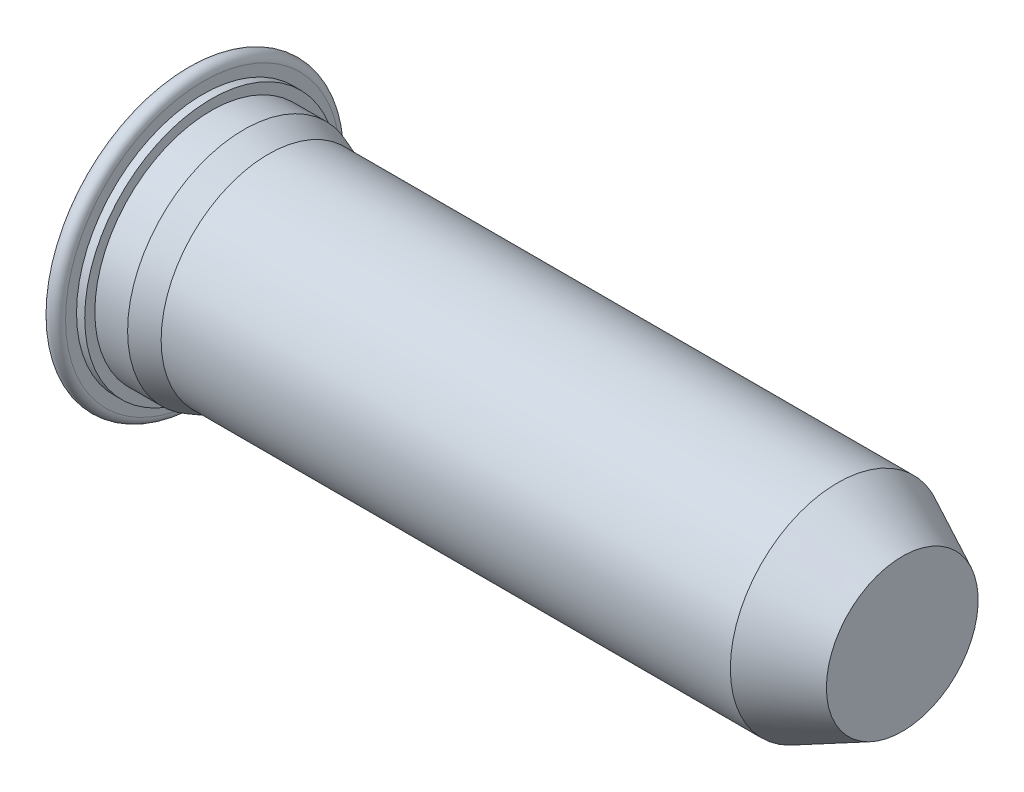
ISO-10303-21;
HEADER;
FILE_DESCRIPTION(('STEP AP214'),'2;1');
FILE_NAME('part.step','',(''),(''),'','','');
FILE_SCHEMA(('AUTOMOTIVE_DESIGN { 1 0 10303 214 1 1 1 1 }'));
ENDSEC;
DATA;
#1=APPLICATION_CONTEXT('core data for automotive mechanical design processes');
#2=APPLICATION_PROTOCOL_DEFINITION('international standard','automotive_design',2000,#1);
#3=PRODUCT_CONTEXT('',#1,'mechanical');
#4=PRODUCT('Part','Part','',(#3));
#5=PRODUCT_RELATED_PRODUCT_CATEGORY('part','',(#4));
#6=PRODUCT_DEFINITION_FORMATION('','',#4);
#7=PRODUCT_DEFINITION_CONTEXT('part definition',#1,'design');
#8=PRODUCT_DEFINITION('design','',#6,#7);
#9=PRODUCT_DEFINITION_SHAPE('','',#8);
#10=(LENGTH_UNIT() NAMED_UNIT(*) SI_UNIT(.MILLI.,.METRE.));
#11=(NAMED_UNIT(*) PLANE_ANGLE_UNIT() SI_UNIT($,.RADIAN.));
#12=(NAMED_UNIT(*) SI_UNIT($,.STERADIAN.) SOLID_ANGLE_UNIT());
#13=UNCERTAINTY_MEASURE_WITH_UNIT(LENGTH_MEASURE(1.E-05),#10,'distance_accuracy_value','');
#14=(GEOMETRIC_REPRESENTATION_CONTEXT(3) GLOBAL_UNCERTAINTY_ASSIGNED_CONTEXT((#13)) GLOBAL_UNIT_ASSIGNED_CONTEXT((#10,
#11,#12)) REPRESENTATION_CONTEXT('',''));
#15=CARTESIAN_POINT('',(0.,0.,0.));
#16=DIRECTION('',(0.,0.,1.));
#17=DIRECTION('',(1.,0.,0.));
#18=AXIS2_PLACEMENT_3D('',#15,#16,#17);
#19=CARTESIAN_POINT('',(0.,0.,0.));
#20=DIRECTION('',(-1.,0.,0.));
#21=DIRECTION('',(0.,0.,1.));
#22=AXIS2_PLACEMENT_3D('',#19,#20,#21);
#23=PLANE('',#22);
#24=CARTESIAN_POINT('',(0.,0.,0.));
#25=DIRECTION('',(-1.,0.,0.));
#26=DIRECTION('',(0.,0.,1.));
#27=AXIS2_PLACEMENT_3D('',#24,#25,#26);
#28=CIRCLE('',#27,3.83346);
#29=CARTESIAN_POINT('',(0.,0.,3.83346));
#30=VERTEX_POINT('',#29);
#31=EDGE_CURVE('E10',#30,#30,#28,.T.);
#32=ORIENTED_EDGE('',*,*,#31,.T.);
#33=EDGE_LOOP('',(#32));
#34=FACE_BOUND('',#33,.T.);
#35=ADVANCED_FACE('F30',(#34),#23,.T.);
#36=CARTESIAN_POINT('',(0.,0.,0.));
#37=DIRECTION('',(-1.,0.,0.));
#38=DIRECTION('',(0.,0.,1.));
#39=AXIS2_PLACEMENT_3D('',#36,#37,#38);
#40=CYLINDRICAL_SURFACE('',#39,3.83346);
#41=CARTESIAN_POINT('',(0.00508000000000002,0.,0.));
#42=DIRECTION('',(-1.,0.,0.));
#43=DIRECTION('',(0.,0.,1.));
#44=AXIS2_PLACEMENT_3D('',#41,#42,#43);
#45=CIRCLE('',#44,3.83346);
#46=CARTESIAN_POINT('',(0.00508000000000002,0.,3.83346));
#47=VERTEX_POINT('',#46);
#48=EDGE_CURVE('E36',#47,#47,#45,.T.);
#49=ORIENTED_EDGE('',*,*,#48,.T.);
#50=EDGE_LOOP('',(#49));
#51=FACE_BOUND('',#50,.T.);
#52=ORIENTED_EDGE('',*,*,#31,.F.);
#53=EDGE_LOOP('',(#52));
#54=FACE_BOUND('',#53,.T.);
#55=ADVANCED_FACE('F83',(#51,#54),#40,.T.);
#56=CARTESIAN_POINT('',(0.00508000000000003,3.83854,0.));
#57=DIRECTION('',(1.,0.,0.));
#58=DIRECTION('',(0.,0.,-1.));
#59=AXIS2_PLACEMENT_3D('',#56,#57,#58);
#60=PLANE('',#59);
#61=ORIENTED_EDGE('',*,*,#48,.F.);
#62=EDGE_LOOP('',(#61));
#63=FACE_BOUND('',#62,.T.);
#64=CARTESIAN_POINT('',(0.00508000000000003,0.,0.));
#65=DIRECTION('',(-1.,0.,0.));
#66=DIRECTION('',(0.,0.,1.));
#67=AXIS2_PLACEMENT_3D('',#64,#65,#66);
#68=CIRCLE('',#67,3.83854);
#69=CARTESIAN_POINT('',(0.00508000000000003,0.,3.83854));
#70=VERTEX_POINT('',#69);
#71=EDGE_CURVE('E40',#70,#70,#68,.T.);
#72=ORIENTED_EDGE('',*,*,#71,.T.);
#73=EDGE_LOOP('',(#72));
#74=FACE_BOUND('',#73,.T.);
#75=ADVANCED_FACE('F87',(#63,#74),#60,.F.);
#76=CARTESIAN_POINT('',(0.23154,0.,0.));
#77=DIRECTION('',(-1.,0.,0.));
#78=DIRECTION('',(0.,0.,1.));
#79=AXIS2_PLACEMENT_3D('',#76,#77,#78);
#80=TOROIDAL_SURFACE('',#79,3.83854,0.22646);
#81=CARTESIAN_POINT('',(0.458,0.,0.));
#82=DIRECTION('',(-1.,0.,0.));
#83=DIRECTION('',(0.,0.,1.));
#84=AXIS2_PLACEMENT_3D('',#81,#82,#83);
#85=CIRCLE('',#84,3.83854);
#86=CARTESIAN_POINT('',(0.458,0.,3.83854));
#87=VERTEX_POINT('',#86);
#88=EDGE_CURVE('E44',#87,#87,#85,.T.);
#89=ORIENTED_EDGE('',*,*,#88,.T.);
#90=EDGE_LOOP('',(#89));
#91=FACE_BOUND('',#90,.T.);
#92=ORIENTED_EDGE('',*,*,#71,.F.);
#93=EDGE_LOOP('',(#92));
#94=FACE_BOUND('',#93,.T.);
#95=ADVANCED_FACE('F91',(#91,#94),#80,.T.);
#96=CARTESIAN_POINT('',(0.458,3.83854,0.));
#97=DIRECTION('',(1.,0.,0.));
#98=DIRECTION('',(0.,0.,-1.));
#99=AXIS2_PLACEMENT_3D('',#96,#97,#98);
#100=PLANE('',#99);
#101=CARTESIAN_POINT('',(0.458,0.,0.));
#102=DIRECTION('',(-1.,0.,0.));
#103=DIRECTION('',(0.,0.,1.));
#104=AXIS2_PLACEMENT_3D('',#101,#102,#103);
#105=CIRCLE('',#104,3.5325);
#106=CARTESIAN_POINT('',(0.458,0.,3.5325));
#107=VERTEX_POINT('',#106);
#108=EDGE_CURVE('E49',#107,#107,#105,.T.);
#109=ORIENTED_EDGE('',*,*,#108,.T.);
#110=EDGE_LOOP('',(#109));
#111=FACE_BOUND('',#110,.T.);
#112=ORIENTED_EDGE('',*,*,#88,.F.);
#113=EDGE_LOOP('',(#112));
#114=FACE_BOUND('',#113,.T.);
#115=ADVANCED_FACE('F98',(#111,#114),#100,.T.);
#116=CARTESIAN_POINT('',(0.,0.,0.));
#117=DIRECTION('',(-1.,0.,0.));
#118=DIRECTION('',(0.,0.,1.));
#119=AXIS2_PLACEMENT_3D('',#116,#117,#118);
#120=CYLINDRICAL_SURFACE('',#119,3.5325);
#121=CARTESIAN_POINT('',(0.687,0.,0.));
#122=DIRECTION('',(-1.,0.,0.));
#123=DIRECTION('',(0.,0.,1.));
#124=AXIS2_PLACEMENT_3D('',#121,#122,#123);
#125=CIRCLE('',#124,3.5325);
#126=CARTESIAN_POINT('',(0.687,0.,3.5325));
#127=VERTEX_POINT('',#126);
#128=EDGE_CURVE('E52',#127,#127,#125,.T.);
#129=ORIENTED_EDGE('',*,*,#128,.T.);
#130=EDGE_LOOP('',(#129));
#131=FACE_BOUND('',#130,.T.);
#132=ORIENTED_EDGE('',*,*,#108,.F.);
#133=EDGE_LOOP('',(#132));
#134=FACE_BOUND('',#133,.T.);
#135=ADVANCED_FACE('F102',(#131,#134),#120,.T.);
#136=CARTESIAN_POINT('',(0.687,3.5325,0.));
#137=DIRECTION('',(1.,0.,0.));
#138=DIRECTION('',(0.,0.,-1.));
#139=AXIS2_PLACEMENT_3D('',#136,#137,#138);
#140=PLANE('',#139);
#141=CARTESIAN_POINT('',(0.687,0.,0.));
#142=DIRECTION('',(-1.,0.,0.));
#143=DIRECTION('',(0.,0.,1.));
#144=AXIS2_PLACEMENT_3D('',#141,#142,#143);
#145=CIRCLE('',#144,3.25);
#146=CARTESIAN_POINT('',(0.687,0.,3.25));
#147=VERTEX_POINT('',#146);
#148=EDGE_CURVE('E55',#147,#147,#145,.T.);
#149=ORIENTED_EDGE('',*,*,#148,.T.);
#150=EDGE_LOOP('',(#149));
#151=FACE_BOUND('',#150,.T.);
#152=ORIENTED_EDGE('',*,*,#128,.F.);
#153=EDGE_LOOP('',(#152));
#154=FACE_BOUND('',#153,.T.);
#155=ADVANCED_FACE('F106',(#151,#154),#140,.T.);
#156=CARTESIAN_POINT('',(0.,0.,0.));
#157=DIRECTION('',(-1.,0.,0.));
#158=DIRECTION('',(0.,0.,1.));
#159=AXIS2_PLACEMENT_3D('',#156,#157,#158);
#160=CYLINDRICAL_SURFACE('',#159,3.25);
#161=ORIENTED_EDGE('',*,*,#148,.F.);
#162=EDGE_LOOP('',(#161));
#163=FACE_BOUND('',#162,.T.);
#164=CARTESIAN_POINT('',(1.60313064513635,0.,0.));
#165=DIRECTION('',(-1.,0.,0.));
#166=DIRECTION('',(0.,0.,1.));
#167=AXIS2_PLACEMENT_3D('',#164,#165,#166);
#168=CIRCLE('',#167,3.25);
#169=CARTESIAN_POINT('',(1.60313064513635,0.,3.25));
#170=VERTEX_POINT('',#169);
#171=EDGE_CURVE('E58',#170,#170,#168,.T.);
#172=ORIENTED_EDGE('',*,*,#171,.T.);
#173=EDGE_LOOP('',(#172));
#174=FACE_BOUND('',#173,.T.);
#175=ADVANCED_FACE('F110',(#163,#174),#160,.T.);
#176=CARTESIAN_POINT('',(2.29,0.,0.));
#177=DIRECTION('',(-1.,0.,0.));
#178=DIRECTION('',(0.,0.,1.));
#179=AXIS2_PLACEMENT_3D('',#176,#177,#178);
#180=CONICAL_SURFACE('',#179,3.,0.349065850398867);
#181=ORIENTED_EDGE('',*,*,#171,.F.);
#182=EDGE_LOOP('',(#181));
#183=FACE_BOUND('',#182,.T.);
#184=CARTESIAN_POINT('',(2.29,0.,0.));
#185=DIRECTION('',(-1.,0.,0.));
#186=DIRECTION('',(0.,0.,1.));
#187=AXIS2_PLACEMENT_3D('',#184,#185,#186);
#188=CIRCLE('',#187,3.);
#189=CARTESIAN_POINT('',(2.29,0.,3.));
#190=VERTEX_POINT('',#189);
#191=EDGE_CURVE('E61',#190,#190,#188,.T.);
#192=ORIENTED_EDGE('',*,*,#191,.T.);
#193=EDGE_LOOP('',(#192));
#194=FACE_BOUND('',#193,.T.);
#195=ADVANCED_FACE('F114',(#183,#194),#180,.T.);
#196=CARTESIAN_POINT('',(0.,0.,0.));
#197=DIRECTION('',(-1.,0.,0.));
#198=DIRECTION('',(0.,0.,1.));
#199=AXIS2_PLACEMENT_3D('',#196,#197,#198);
#200=CYLINDRICAL_SURFACE('',#199,3.);
#201=CARTESIAN_POINT('',(18.1957326194102,0.,0.));
#202=DIRECTION('',(-1.,0.,0.));
#203=DIRECTION('',(0.,0.,1.));
#204=AXIS2_PLACEMENT_3D('',#201,#202,#203);
#205=CIRCLE('',#204,3.);
#206=CARTESIAN_POINT('',(18.1957326194102,0.,3.));
#207=VERTEX_POINT('',#206);
#208=EDGE_CURVE('E64',#207,#207,#205,.T.);
#209=ORIENTED_EDGE('',*,*,#208,.T.);
#210=EDGE_LOOP('',(#209));
#211=FACE_BOUND('',#210,.T.);
#212=ORIENTED_EDGE('',*,*,#191,.F.);
#213=EDGE_LOOP('',(#212));
#214=FACE_BOUND('',#213,.T.);
#215=ADVANCED_FACE('F79',(#211,#214),#200,.T.);
#216=CARTESIAN_POINT('',(20.,0.,0.));
#217=DIRECTION('',(-1.,0.,0.));
#218=DIRECTION('',(0.,0.,1.));
#219=AXIS2_PLACEMENT_3D('',#216,#217,#218);
#220=CONICAL_SURFACE('',#219,2.12,0.45378560551853);
#221=ORIENTED_EDGE('',*,*,#208,.F.);
#222=EDGE_LOOP('',(#221));
#223=FACE_BOUND('',#222,.T.);
#224=CARTESIAN_POINT('',(20.,0.,0.));
#225=DIRECTION('',(-1.,0.,0.));
#226=DIRECTION('',(0.,0.,1.));
#227=AXIS2_PLACEMENT_3D('',#224,#225,#226);
#228=CIRCLE('',#227,2.12);
#229=CARTESIAN_POINT('',(20.,0.,2.12));
#230=VERTEX_POINT('',#229);
#231=EDGE_CURVE('E67',#230,#230,#228,.T.);
#232=ORIENTED_EDGE('',*,*,#231,.T.);
#233=EDGE_LOOP('',(#232));
#234=FACE_BOUND('',#233,.T.);
#235=ADVANCED_FACE('F71',(#223,#234),#220,.T.);
#236=CARTESIAN_POINT('',(20.,2.12,0.));
#237=DIRECTION('',(1.,0.,0.));
#238=DIRECTION('',(0.,0.,-1.));
#239=AXIS2_PLACEMENT_3D('',#236,#237,#238);
#240=PLANE('',#239);
#241=ORIENTED_EDGE('',*,*,#231,.F.);
#242=EDGE_LOOP('',(#241));
#243=FACE_BOUND('',#242,.T.);
#244=ADVANCED_FACE('F73',(#243),#240,.T.);
#245=CLOSED_SHELL('',(#35,#55,#75,#95,#115,#135,#155,#175,#195,#215,#235,#244));
#246=MANIFOLD_SOLID_BREP('B2',#245);
#247=ADVANCED_BREP_SHAPE_REPRESENTATION('',(#18,#246),#14);
#248=SHAPE_DEFINITION_REPRESENTATION(#9,#247);
ENDSEC;
END-ISO-10303-21;
